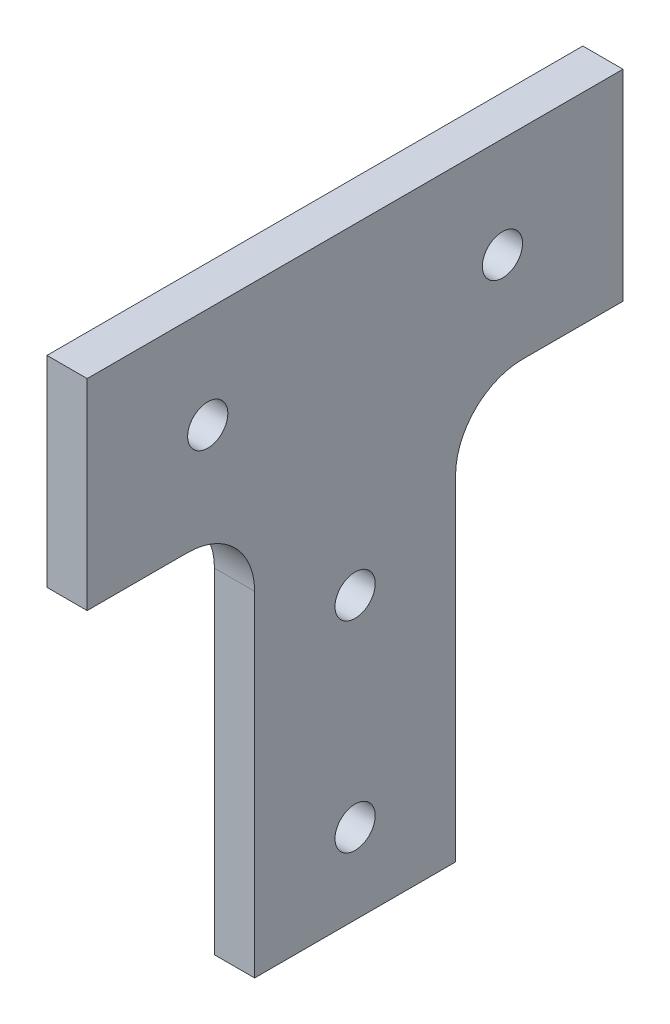
ISO-10303-21;
HEADER;
FILE_DESCRIPTION(('STEP AP214'),'2;1');
FILE_NAME('part.step','',(''),(''),'','','');
FILE_SCHEMA(('AUTOMOTIVE_DESIGN { 1 0 10303 214 1 1 1 1 }'));
ENDSEC;
DATA;
#1=APPLICATION_CONTEXT('core data for automotive mechanical design processes');
#2=APPLICATION_PROTOCOL_DEFINITION('international standard','automotive_design',2000,#1);
#3=PRODUCT_CONTEXT('',#1,'mechanical');
#4=PRODUCT('Part','Part','',(#3));
#5=PRODUCT_RELATED_PRODUCT_CATEGORY('part','',(#4));
#6=PRODUCT_DEFINITION_FORMATION('','',#4);
#7=PRODUCT_DEFINITION_CONTEXT('part definition',#1,'design');
#8=PRODUCT_DEFINITION('design','',#6,#7);
#9=PRODUCT_DEFINITION_SHAPE('','',#8);
#10=(LENGTH_UNIT() NAMED_UNIT(*) SI_UNIT(.MILLI.,.METRE.));
#11=(NAMED_UNIT(*) PLANE_ANGLE_UNIT() SI_UNIT($,.RADIAN.));
#12=(NAMED_UNIT(*) SI_UNIT($,.STERADIAN.) SOLID_ANGLE_UNIT());
#13=UNCERTAINTY_MEASURE_WITH_UNIT(LENGTH_MEASURE(1.E-05),#10,'distance_accuracy_value','');
#14=(GEOMETRIC_REPRESENTATION_CONTEXT(3) GLOBAL_UNCERTAINTY_ASSIGNED_CONTEXT((#13)) GLOBAL_UNIT_ASSIGNED_CONTEXT((#10,
#11,#12)) REPRESENTATION_CONTEXT('',''));
#15=CARTESIAN_POINT('',(0.,0.,0.));
#16=DIRECTION('',(0.,0.,1.));
#17=DIRECTION('',(1.,0.,0.));
#18=AXIS2_PLACEMENT_3D('',#15,#16,#17);
#19=CARTESIAN_POINT('',(3.,-15.,0.));
#20=DIRECTION('',(0.,0.,-1.));
#21=DIRECTION('',(-1.,0.,0.));
#22=AXIS2_PLACEMENT_3D('',#19,#20,#21);
#23=PLANE('',#22);
#24=DIRECTION('',(0.,-1.,0.));
#25=VECTOR('',#24,1.);
#26=CARTESIAN_POINT('',(0.,-15.,0.));
#27=LINE('',#26,#25);
#28=CARTESIAN_POINT('',(0.,0.,0.));
#29=VERTEX_POINT('',#28);
#30=CARTESIAN_POINT('',(0.,-15.,0.));
#31=VERTEX_POINT('',#30);
#32=EDGE_CURVE('E147',#29,#31,#27,.T.);
#33=ORIENTED_EDGE('',*,*,#32,.T.);
#34=DIRECTION('',(-1.,0.,0.));
#35=VECTOR('',#34,1.);
#36=CARTESIAN_POINT('',(3.,-15.,0.));
#37=LINE('',#36,#35);
#38=CARTESIAN_POINT('',(3.,-15.,0.));
#39=VERTEX_POINT('',#38);
#40=EDGE_CURVE('E11',#39,#31,#37,.T.);
#41=ORIENTED_EDGE('',*,*,#40,.F.);
#42=DIRECTION('',(0.,-1.,0.));
#43=VECTOR('',#42,1.);
#44=CARTESIAN_POINT('',(3.,-15.,0.));
#45=LINE('',#44,#43);
#46=CARTESIAN_POINT('',(3.,0.,0.));
#47=VERTEX_POINT('',#46);
#48=EDGE_CURVE('E166',#47,#39,#45,.T.);
#49=ORIENTED_EDGE('',*,*,#48,.F.);
#50=DIRECTION('',(-1.,0.,0.));
#51=VECTOR('',#50,1.);
#52=CARTESIAN_POINT('',(3.,0.,0.));
#53=LINE('',#52,#51);
#54=EDGE_CURVE('E143',#47,#29,#53,.T.);
#55=ORIENTED_EDGE('',*,*,#54,.T.);
#56=EDGE_LOOP('',(#33,#41,#49,#55));
#57=FACE_BOUND('',#56,.T.);
#58=ADVANCED_FACE('F39',(#57),#23,.F.);
#59=CARTESIAN_POINT('',(3.,-15.,-7.49999999999997));
#60=DIRECTION('',(0.,1.,0.));
#61=DIRECTION('',(0.,0.,1.));
#62=AXIS2_PLACEMENT_3D('',#59,#60,#61);
#63=PLANE('',#62);
#64=DIRECTION('',(0.,0.,-1.));
#65=VECTOR('',#64,1.);
#66=CARTESIAN_POINT('',(0.,-15.,-7.49999999999997));
#67=LINE('',#66,#65);
#68=CARTESIAN_POINT('',(0.,-15.,-7.49999999999997));
#69=VERTEX_POINT('',#68);
#70=EDGE_CURVE('E150',#31,#69,#67,.T.);
#71=ORIENTED_EDGE('',*,*,#70,.T.);
#72=DIRECTION('',(-1.,0.,0.));
#73=VECTOR('',#72,1.);
#74=CARTESIAN_POINT('',(3.,-15.,-7.49999999999997));
#75=LINE('',#74,#73);
#76=CARTESIAN_POINT('',(3.,-15.,-7.49999999999997));
#77=VERTEX_POINT('',#76);
#78=EDGE_CURVE('E47',#77,#69,#75,.T.);
#79=ORIENTED_EDGE('',*,*,#78,.F.);
#80=DIRECTION('',(0.,0.,-1.));
#81=VECTOR('',#80,1.);
#82=CARTESIAN_POINT('',(3.,-15.,-7.49999999999997));
#83=LINE('',#82,#81);
#84=EDGE_CURVE('E104',#39,#77,#83,.T.);
#85=ORIENTED_EDGE('',*,*,#84,.F.);
#86=ORIENTED_EDGE('',*,*,#40,.T.);
#87=EDGE_LOOP('',(#71,#79,#85,#86));
#88=FACE_BOUND('',#87,.T.);
#89=ADVANCED_FACE('F271',(#88),#63,.F.);
#90=CARTESIAN_POINT('',(3.,-20.,-7.5));
#91=DIRECTION('',(-1.,0.,0.));
#92=DIRECTION('',(0.,0.,1.));
#93=AXIS2_PLACEMENT_3D('',#90,#91,#92);
#94=CYLINDRICAL_SURFACE('',#93,5.);
#95=CARTESIAN_POINT('',(0.,-20.,-7.5));
#96=DIRECTION('',(-1.,0.,0.));
#97=DIRECTION('',(0.,0.,-1.));
#98=AXIS2_PLACEMENT_3D('',#95,#96,#97);
#99=CIRCLE('',#98,5.);
#100=CARTESIAN_POINT('',(0.,-20.,-12.5));
#101=VERTEX_POINT('',#100);
#102=EDGE_CURVE('E153',#69,#101,#99,.T.);
#103=ORIENTED_EDGE('',*,*,#102,.T.);
#104=DIRECTION('',(-1.,0.,0.));
#105=VECTOR('',#104,1.);
#106=CARTESIAN_POINT('',(3.,-20.,-12.5));
#107=LINE('',#106,#105);
#108=CARTESIAN_POINT('',(3.,-20.,-12.5));
#109=VERTEX_POINT('',#108);
#110=EDGE_CURVE('E179',#109,#101,#107,.T.);
#111=ORIENTED_EDGE('',*,*,#110,.F.);
#112=CARTESIAN_POINT('',(3.,-20.,-7.5));
#113=DIRECTION('',(-1.,0.,0.));
#114=DIRECTION('',(0.,0.,-1.));
#115=AXIS2_PLACEMENT_3D('',#112,#113,#114);
#116=CIRCLE('',#115,5.);
#117=EDGE_CURVE('E187',#77,#109,#116,.T.);
#118=ORIENTED_EDGE('',*,*,#117,.F.);
#119=ORIENTED_EDGE('',*,*,#78,.T.);
#120=EDGE_LOOP('',(#103,#111,#118,#119));
#121=FACE_BOUND('',#120,.T.);
#122=ADVANCED_FACE('F185',(#121),#94,.F.);
#123=CARTESIAN_POINT('',(3.,-45.,-12.5));
#124=DIRECTION('',(0.,0.,-1.));
#125=DIRECTION('',(0.,1.,0.));
#126=AXIS2_PLACEMENT_3D('',#123,#124,#125);
#127=PLANE('',#126);
#128=DIRECTION('',(0.,-1.,0.));
#129=VECTOR('',#128,1.);
#130=CARTESIAN_POINT('',(0.,-45.,-12.5));
#131=LINE('',#130,#129);
#132=CARTESIAN_POINT('',(0.,-45.,-12.5));
#133=VERTEX_POINT('',#132);
#134=EDGE_CURVE('E155',#101,#133,#131,.T.);
#135=ORIENTED_EDGE('',*,*,#134,.T.);
#136=DIRECTION('',(-1.,0.,0.));
#137=VECTOR('',#136,1.);
#138=CARTESIAN_POINT('',(3.,-45.,-12.5));
#139=LINE('',#138,#137);
#140=CARTESIAN_POINT('',(3.,-45.,-12.5));
#141=VERTEX_POINT('',#140);
#142=EDGE_CURVE('E176',#141,#133,#139,.T.);
#143=ORIENTED_EDGE('',*,*,#142,.F.);
#144=DIRECTION('',(0.,-1.,0.));
#145=VECTOR('',#144,1.);
#146=CARTESIAN_POINT('',(3.,-45.,-12.5));
#147=LINE('',#146,#145);
#148=EDGE_CURVE('E205',#109,#141,#147,.T.);
#149=ORIENTED_EDGE('',*,*,#148,.F.);
#150=ORIENTED_EDGE('',*,*,#110,.T.);
#151=EDGE_LOOP('',(#135,#143,#149,#150));
#152=FACE_BOUND('',#151,.T.);
#153=ADVANCED_FACE('F196',(#152),#127,.F.);
#154=CARTESIAN_POINT('',(3.,-45.,-27.5));
#155=DIRECTION('',(0.,1.,0.));
#156=DIRECTION('',(0.,0.,1.));
#157=AXIS2_PLACEMENT_3D('',#154,#155,#156);
#158=PLANE('',#157);
#159=DIRECTION('',(0.,0.,-1.));
#160=VECTOR('',#159,1.);
#161=CARTESIAN_POINT('',(0.,-45.,-27.5));
#162=LINE('',#161,#160);
#163=CARTESIAN_POINT('',(0.,-45.,-27.5));
#164=VERTEX_POINT('',#163);
#165=EDGE_CURVE('E157',#133,#164,#162,.T.);
#166=ORIENTED_EDGE('',*,*,#165,.T.);
#167=DIRECTION('',(-1.,0.,0.));
#168=VECTOR('',#167,1.);
#169=CARTESIAN_POINT('',(3.,-45.,-27.5));
#170=LINE('',#169,#168);
#171=CARTESIAN_POINT('',(3.,-45.,-27.5));
#172=VERTEX_POINT('',#171);
#173=EDGE_CURVE('E173',#172,#164,#170,.T.);
#174=ORIENTED_EDGE('',*,*,#173,.F.);
#175=DIRECTION('',(0.,0.,-1.));
#176=VECTOR('',#175,1.);
#177=CARTESIAN_POINT('',(3.,-45.,-27.5));
#178=LINE('',#177,#176);
#179=EDGE_CURVE('E202',#141,#172,#178,.T.);
#180=ORIENTED_EDGE('',*,*,#179,.F.);
#181=ORIENTED_EDGE('',*,*,#142,.T.);
#182=EDGE_LOOP('',(#166,#174,#180,#181));
#183=FACE_BOUND('',#182,.T.);
#184=ADVANCED_FACE('F200',(#183),#158,.F.);
#185=CARTESIAN_POINT('',(3.,-20.,-27.5));
#186=DIRECTION('',(0.,0.,1.));
#187=DIRECTION('',(0.,-1.,0.));
#188=AXIS2_PLACEMENT_3D('',#185,#186,#187);
#189=PLANE('',#188);
#190=DIRECTION('',(0.,1.,0.));
#191=VECTOR('',#190,1.);
#192=CARTESIAN_POINT('',(0.,-20.,-27.5));
#193=LINE('',#192,#191);
#194=CARTESIAN_POINT('',(0.,-20.,-27.5));
#195=VERTEX_POINT('',#194);
#196=EDGE_CURVE('E159',#164,#195,#193,.T.);
#197=ORIENTED_EDGE('',*,*,#196,.T.);
#198=DIRECTION('',(-1.,0.,0.));
#199=VECTOR('',#198,1.);
#200=CARTESIAN_POINT('',(3.,-20.,-27.5));
#201=LINE('',#200,#199);
#202=CARTESIAN_POINT('',(3.,-20.,-27.5));
#203=VERTEX_POINT('',#202);
#204=EDGE_CURVE('E170',#203,#195,#201,.T.);
#205=ORIENTED_EDGE('',*,*,#204,.F.);
#206=DIRECTION('',(0.,1.,0.));
#207=VECTOR('',#206,1.);
#208=CARTESIAN_POINT('',(3.,-20.,-27.5));
#209=LINE('',#208,#207);
#210=EDGE_CURVE('E204',#172,#203,#209,.T.);
#211=ORIENTED_EDGE('',*,*,#210,.F.);
#212=ORIENTED_EDGE('',*,*,#173,.T.);
#213=EDGE_LOOP('',(#197,#205,#211,#212));
#214=FACE_BOUND('',#213,.T.);
#215=ADVANCED_FACE('F283',(#214),#189,.F.);
#216=CARTESIAN_POINT('',(3.,-20.,-32.5));
#217=DIRECTION('',(-1.,0.,0.));
#218=DIRECTION('',(0.,0.,1.));
#219=AXIS2_PLACEMENT_3D('',#216,#217,#218);
#220=CYLINDRICAL_SURFACE('',#219,4.99999999999999);
#221=CARTESIAN_POINT('',(0.,-20.,-32.5));
#222=DIRECTION('',(-1.,0.,0.));
#223=DIRECTION('',(0.,0.,-1.));
#224=AXIS2_PLACEMENT_3D('',#221,#222,#223);
#225=CIRCLE('',#224,4.99999999999999);
#226=CARTESIAN_POINT('',(0.,-15.,-32.5));
#227=VERTEX_POINT('',#226);
#228=EDGE_CURVE('E161',#195,#227,#225,.T.);
#229=ORIENTED_EDGE('',*,*,#228,.T.);
#230=DIRECTION('',(-1.,0.,0.));
#231=VECTOR('',#230,1.);
#232=CARTESIAN_POINT('',(3.,-15.,-32.5));
#233=LINE('',#232,#231);
#234=CARTESIAN_POINT('',(3.,-15.,-32.5));
#235=VERTEX_POINT('',#234);
#236=EDGE_CURVE('E138',#235,#227,#233,.T.);
#237=ORIENTED_EDGE('',*,*,#236,.F.);
#238=CARTESIAN_POINT('',(3.,-20.,-32.5));
#239=DIRECTION('',(-1.,0.,0.));
#240=DIRECTION('',(0.,0.,-1.));
#241=AXIS2_PLACEMENT_3D('',#238,#239,#240);
#242=CIRCLE('',#241,4.99999999999999);
#243=EDGE_CURVE('E129',#203,#235,#242,.T.);
#244=ORIENTED_EDGE('',*,*,#243,.F.);
#245=ORIENTED_EDGE('',*,*,#204,.T.);
#246=EDGE_LOOP('',(#229,#237,#244,#245));
#247=FACE_BOUND('',#246,.T.);
#248=ADVANCED_FACE('F280',(#247),#220,.F.);
#249=CARTESIAN_POINT('',(3.,-15.,-40.));
#250=DIRECTION('',(0.,1.,0.));
#251=DIRECTION('',(0.,0.,1.));
#252=AXIS2_PLACEMENT_3D('',#249,#250,#251);
#253=PLANE('',#252);
#254=DIRECTION('',(0.,0.,-1.));
#255=VECTOR('',#254,1.);
#256=CARTESIAN_POINT('',(0.,-15.,-40.));
#257=LINE('',#256,#255);
#258=CARTESIAN_POINT('',(0.,-15.,-40.));
#259=VERTEX_POINT('',#258);
#260=EDGE_CURVE('E137',#227,#259,#257,.T.);
#261=ORIENTED_EDGE('',*,*,#260,.T.);
#262=DIRECTION('',(-1.,0.,0.));
#263=VECTOR('',#262,1.);
#264=CARTESIAN_POINT('',(3.,-15.,-40.));
#265=LINE('',#264,#263);
#266=CARTESIAN_POINT('',(3.,-15.,-40.));
#267=VERTEX_POINT('',#266);
#268=EDGE_CURVE('E134',#267,#259,#265,.T.);
#269=ORIENTED_EDGE('',*,*,#268,.F.);
#270=DIRECTION('',(0.,0.,-1.));
#271=VECTOR('',#270,1.);
#272=CARTESIAN_POINT('',(3.,-15.,-40.));
#273=LINE('',#272,#271);
#274=EDGE_CURVE('E123',#235,#267,#273,.T.);
#275=ORIENTED_EDGE('',*,*,#274,.F.);
#276=ORIENTED_EDGE('',*,*,#236,.T.);
#277=EDGE_LOOP('',(#261,#269,#275,#276));
#278=FACE_BOUND('',#277,.T.);
#279=ADVANCED_FACE('F135',(#278),#253,.F.);
#280=CARTESIAN_POINT('',(3.,0.,-40.));
#281=DIRECTION('',(0.,0.,1.));
#282=DIRECTION('',(1.,0.,0.));
#283=AXIS2_PLACEMENT_3D('',#280,#281,#282);
#284=PLANE('',#283);
#285=DIRECTION('',(0.,1.,0.));
#286=VECTOR('',#285,1.);
#287=CARTESIAN_POINT('',(0.,0.,-40.));
#288=LINE('',#287,#286);
#289=CARTESIAN_POINT('',(0.,0.,-40.));
#290=VERTEX_POINT('',#289);
#291=EDGE_CURVE('E90',#259,#290,#288,.T.);
#292=ORIENTED_EDGE('',*,*,#291,.T.);
#293=DIRECTION('',(-1.,0.,0.));
#294=VECTOR('',#293,1.);
#295=CARTESIAN_POINT('',(3.,0.,-40.));
#296=LINE('',#295,#294);
#297=CARTESIAN_POINT('',(3.,0.,-40.));
#298=VERTEX_POINT('',#297);
#299=EDGE_CURVE('E139',#298,#290,#296,.T.);
#300=ORIENTED_EDGE('',*,*,#299,.F.);
#301=DIRECTION('',(0.,1.,0.));
#302=VECTOR('',#301,1.);
#303=CARTESIAN_POINT('',(3.,0.,-40.));
#304=LINE('',#303,#302);
#305=EDGE_CURVE('E127',#267,#298,#304,.T.);
#306=ORIENTED_EDGE('',*,*,#305,.F.);
#307=ORIENTED_EDGE('',*,*,#268,.T.);
#308=EDGE_LOOP('',(#292,#300,#306,#307));
#309=FACE_BOUND('',#308,.T.);
#310=ADVANCED_FACE('F141',(#309),#284,.F.);
#311=CARTESIAN_POINT('',(3.,0.,0.));
#312=DIRECTION('',(0.,-1.,0.));
#313=DIRECTION('',(0.,0.,-1.));
#314=AXIS2_PLACEMENT_3D('',#311,#312,#313);
#315=PLANE('',#314);
#316=DIRECTION('',(0.,0.,1.));
#317=VECTOR('',#316,1.);
#318=CARTESIAN_POINT('',(0.,0.,0.));
#319=LINE('',#318,#317);
#320=EDGE_CURVE('E96',#290,#29,#319,.T.);
#321=ORIENTED_EDGE('',*,*,#320,.T.);
#322=ORIENTED_EDGE('',*,*,#54,.F.);
#323=DIRECTION('',(0.,0.,1.));
#324=VECTOR('',#323,1.);
#325=CARTESIAN_POINT('',(3.,0.,0.));
#326=LINE('',#325,#324);
#327=EDGE_CURVE('E55',#298,#47,#326,.T.);
#328=ORIENTED_EDGE('',*,*,#327,.F.);
#329=ORIENTED_EDGE('',*,*,#299,.T.);
#330=EDGE_LOOP('',(#321,#322,#328,#329));
#331=FACE_BOUND('',#330,.T.);
#332=ADVANCED_FACE('F248',(#331),#315,.F.);
#333=CARTESIAN_POINT('',(3.,-20.,-32.5));
#334=DIRECTION('',(1.,0.,0.));
#335=DIRECTION('',(0.,0.,-1.));
#336=AXIS2_PLACEMENT_3D('',#333,#334,#335);
#337=PLANE('',#336);
#338=CARTESIAN_POINT('',(3.,-7.5,-31.));
#339=DIRECTION('',(1.,0.,0.));
#340=DIRECTION('',(0.,0.,-1.));
#341=AXIS2_PLACEMENT_3D('',#338,#339,#340);
#342=CIRCLE('',#341,1.5);
#343=CARTESIAN_POINT('',(3.,-7.5,-32.5));
#344=VERTEX_POINT('',#343);
#345=EDGE_CURVE('E226',#344,#344,#342,.T.);
#346=ORIENTED_EDGE('',*,*,#345,.F.);
#347=EDGE_LOOP('',(#346));
#348=FACE_BOUND('',#347,.T.);
#349=CARTESIAN_POINT('',(3.,-24.,-20.));
#350=DIRECTION('',(1.,0.,0.));
#351=DIRECTION('',(0.,0.,-1.));
#352=AXIS2_PLACEMENT_3D('',#349,#350,#351);
#353=CIRCLE('',#352,1.5);
#354=CARTESIAN_POINT('',(3.,-24.,-21.5));
#355=VERTEX_POINT('',#354);
#356=EDGE_CURVE('E227',#355,#355,#353,.T.);
#357=ORIENTED_EDGE('',*,*,#356,.F.);
#358=EDGE_LOOP('',(#357));
#359=FACE_BOUND('',#358,.T.);
#360=CARTESIAN_POINT('',(3.,-39.,-20.));
#361=DIRECTION('',(1.,0.,0.));
#362=DIRECTION('',(0.,0.,-1.));
#363=AXIS2_PLACEMENT_3D('',#360,#361,#362);
#364=CIRCLE('',#363,1.5);
#365=CARTESIAN_POINT('',(3.,-39.,-21.5));
#366=VERTEX_POINT('',#365);
#367=EDGE_CURVE('E213',#366,#366,#364,.T.);
#368=ORIENTED_EDGE('',*,*,#367,.F.);
#369=EDGE_LOOP('',(#368));
#370=FACE_BOUND('',#369,.T.);
#371=CARTESIAN_POINT('',(3.,-7.5,-9.));
#372=DIRECTION('',(1.,0.,0.));
#373=DIRECTION('',(0.,0.,-1.));
#374=AXIS2_PLACEMENT_3D('',#371,#372,#373);
#375=CIRCLE('',#374,1.5);
#376=CARTESIAN_POINT('',(3.,-7.5,-10.5));
#377=VERTEX_POINT('',#376);
#378=EDGE_CURVE('E220',#377,#377,#375,.T.);
#379=ORIENTED_EDGE('',*,*,#378,.F.);
#380=EDGE_LOOP('',(#379));
#381=FACE_BOUND('',#380,.T.);
#382=ORIENTED_EDGE('',*,*,#48,.T.);
#383=ORIENTED_EDGE('',*,*,#84,.T.);
#384=ORIENTED_EDGE('',*,*,#117,.T.);
#385=ORIENTED_EDGE('',*,*,#148,.T.);
#386=ORIENTED_EDGE('',*,*,#179,.T.);
#387=ORIENTED_EDGE('',*,*,#210,.T.);
#388=ORIENTED_EDGE('',*,*,#243,.T.);
#389=ORIENTED_EDGE('',*,*,#274,.T.);
#390=ORIENTED_EDGE('',*,*,#305,.T.);
#391=ORIENTED_EDGE('',*,*,#327,.T.);
#392=EDGE_LOOP('',(#382,#383,#384,#385,#386,#387,#388,#389,#390,#391));
#393=FACE_BOUND('',#392,.T.);
#394=ADVANCED_FACE('F125',(#348,#359,#370,#381,#393),#337,.T.);
#395=CARTESIAN_POINT('',(0.,-20.,-32.5));
#396=DIRECTION('',(1.,0.,0.));
#397=DIRECTION('',(0.,0.,-1.));
#398=AXIS2_PLACEMENT_3D('',#395,#396,#397);
#399=PLANE('',#398);
#400=CARTESIAN_POINT('',(0.,-7.5,-31.));
#401=DIRECTION('',(1.,0.,0.));
#402=DIRECTION('',(0.,0.,-1.));
#403=AXIS2_PLACEMENT_3D('',#400,#401,#402);
#404=CIRCLE('',#403,1.5);
#405=CARTESIAN_POINT('',(0.,-7.5,-32.5));
#406=VERTEX_POINT('',#405);
#407=EDGE_CURVE('E151',#406,#406,#404,.T.);
#408=ORIENTED_EDGE('',*,*,#407,.T.);
#409=EDGE_LOOP('',(#408));
#410=FACE_BOUND('',#409,.T.);
#411=CARTESIAN_POINT('',(0.,-24.,-20.));
#412=DIRECTION('',(1.,0.,0.));
#413=DIRECTION('',(0.,0.,-1.));
#414=AXIS2_PLACEMENT_3D('',#411,#412,#413);
#415=CIRCLE('',#414,1.5);
#416=CARTESIAN_POINT('',(0.,-24.,-21.5));
#417=VERTEX_POINT('',#416);
#418=EDGE_CURVE('E217',#417,#417,#415,.T.);
#419=ORIENTED_EDGE('',*,*,#418,.T.);
#420=EDGE_LOOP('',(#419));
#421=FACE_BOUND('',#420,.T.);
#422=CARTESIAN_POINT('',(0.,-39.,-20.));
#423=DIRECTION('',(1.,0.,0.));
#424=DIRECTION('',(0.,0.,-1.));
#425=AXIS2_PLACEMENT_3D('',#422,#423,#424);
#426=CIRCLE('',#425,1.5);
#427=CARTESIAN_POINT('',(0.,-39.,-21.5));
#428=VERTEX_POINT('',#427);
#429=EDGE_CURVE('E216',#428,#428,#426,.T.);
#430=ORIENTED_EDGE('',*,*,#429,.T.);
#431=EDGE_LOOP('',(#430));
#432=FACE_BOUND('',#431,.T.);
#433=CARTESIAN_POINT('',(0.,-7.5,-9.));
#434=DIRECTION('',(1.,0.,0.));
#435=DIRECTION('',(0.,0.,-1.));
#436=AXIS2_PLACEMENT_3D('',#433,#434,#435);
#437=CIRCLE('',#436,1.5);
#438=CARTESIAN_POINT('',(0.,-7.5,-10.5));
#439=VERTEX_POINT('',#438);
#440=EDGE_CURVE('E223',#439,#439,#437,.T.);
#441=ORIENTED_EDGE('',*,*,#440,.T.);
#442=EDGE_LOOP('',(#441));
#443=FACE_BOUND('',#442,.T.);
#444=ORIENTED_EDGE('',*,*,#32,.F.);
#445=ORIENTED_EDGE('',*,*,#320,.F.);
#446=ORIENTED_EDGE('',*,*,#291,.F.);
#447=ORIENTED_EDGE('',*,*,#260,.F.);
#448=ORIENTED_EDGE('',*,*,#228,.F.);
#449=ORIENTED_EDGE('',*,*,#196,.F.);
#450=ORIENTED_EDGE('',*,*,#165,.F.);
#451=ORIENTED_EDGE('',*,*,#134,.F.);
#452=ORIENTED_EDGE('',*,*,#102,.F.);
#453=ORIENTED_EDGE('',*,*,#70,.F.);
#454=EDGE_LOOP('',(#444,#445,#446,#447,#448,#449,#450,#451,#452,#453));
#455=FACE_BOUND('',#454,.T.);
#456=ADVANCED_FACE('F191',(#410,#421,#432,#443,#455),#399,.F.);
#457=CARTESIAN_POINT('',(0.,-7.5,-9.));
#458=DIRECTION('',(1.,0.,0.));
#459=DIRECTION('',(0.,0.,-1.));
#460=AXIS2_PLACEMENT_3D('',#457,#458,#459);
#461=CYLINDRICAL_SURFACE('',#460,1.5);
#462=ORIENTED_EDGE('',*,*,#440,.F.);
#463=EDGE_LOOP('',(#462));
#464=FACE_BOUND('',#463,.T.);
#465=ORIENTED_EDGE('',*,*,#378,.T.);
#466=EDGE_LOOP('',(#465));
#467=FACE_BOUND('',#466,.T.);
#468=ADVANCED_FACE('F256',(#464,#467),#461,.F.);
#469=CARTESIAN_POINT('',(0.,-39.,-20.));
#470=DIRECTION('',(1.,0.,0.));
#471=DIRECTION('',(0.,0.,-1.));
#472=AXIS2_PLACEMENT_3D('',#469,#470,#471);
#473=CYLINDRICAL_SURFACE('',#472,1.5);
#474=ORIENTED_EDGE('',*,*,#429,.F.);
#475=EDGE_LOOP('',(#474));
#476=FACE_BOUND('',#475,.T.);
#477=ORIENTED_EDGE('',*,*,#367,.T.);
#478=EDGE_LOOP('',(#477));
#479=FACE_BOUND('',#478,.T.);
#480=ADVANCED_FACE('F258',(#476,#479),#473,.F.);
#481=CARTESIAN_POINT('',(0.,-24.,-20.));
#482=DIRECTION('',(1.,0.,0.));
#483=DIRECTION('',(0.,0.,-1.));
#484=AXIS2_PLACEMENT_3D('',#481,#482,#483);
#485=CYLINDRICAL_SURFACE('',#484,1.5);
#486=ORIENTED_EDGE('',*,*,#418,.F.);
#487=EDGE_LOOP('',(#486));
#488=FACE_BOUND('',#487,.T.);
#489=ORIENTED_EDGE('',*,*,#356,.T.);
#490=EDGE_LOOP('',(#489));
#491=FACE_BOUND('',#490,.T.);
#492=ADVANCED_FACE('F242',(#488,#491),#485,.F.);
#493=CARTESIAN_POINT('',(0.,-7.5,-31.));
#494=DIRECTION('',(1.,0.,0.));
#495=DIRECTION('',(0.,0.,-1.));
#496=AXIS2_PLACEMENT_3D('',#493,#494,#495);
#497=CYLINDRICAL_SURFACE('',#496,1.5);
#498=ORIENTED_EDGE('',*,*,#407,.F.);
#499=EDGE_LOOP('',(#498));
#500=FACE_BOUND('',#499,.T.);
#501=ORIENTED_EDGE('',*,*,#345,.T.);
#502=EDGE_LOOP('',(#501));
#503=FACE_BOUND('',#502,.T.);
#504=ADVANCED_FACE('F239',(#500,#503),#497,.F.);
#505=CLOSED_SHELL('',(#58,#89,#122,#153,#184,#215,#248,#279,#310,#332,#394,#456,#468,#480,#492,#504));
#506=MANIFOLD_SOLID_BREP('B2',#505);
#507=ADVANCED_BREP_SHAPE_REPRESENTATION('',(#18,#506),#14);
#508=SHAPE_DEFINITION_REPRESENTATION(#9,#507);
ENDSEC;
END-ISO-10303-21;
